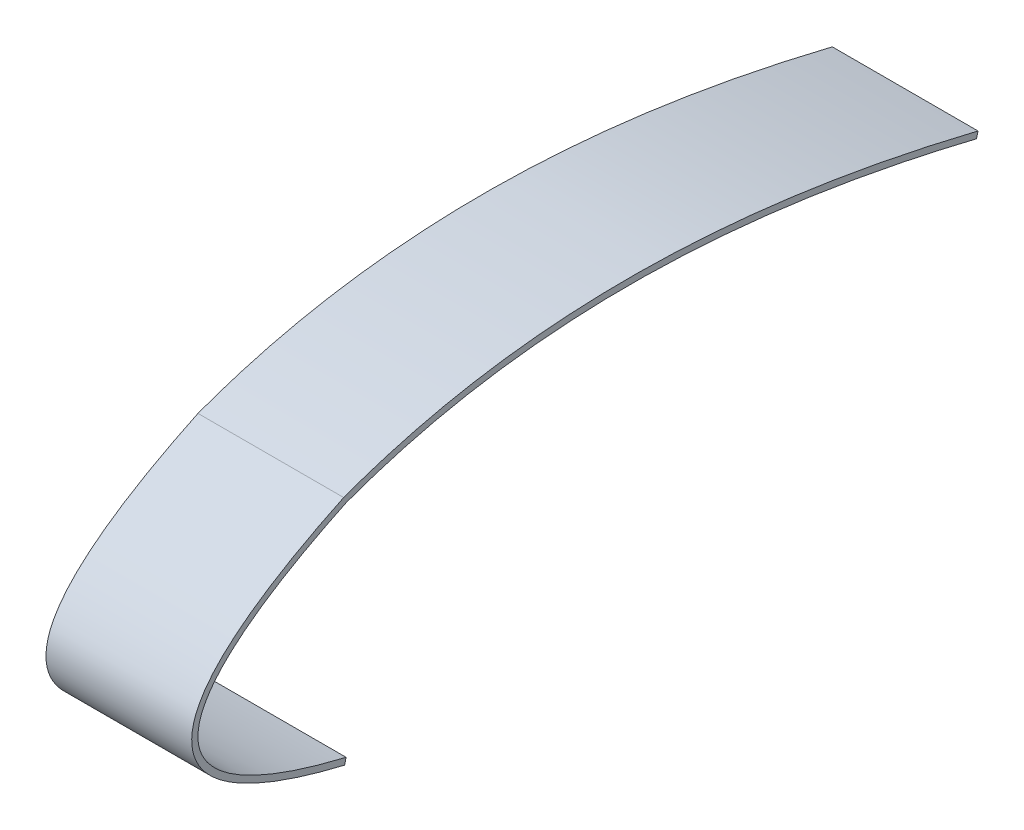
ISO-10303-21;
HEADER;
FILE_DESCRIPTION(('STEP AP214'),'2;1');
FILE_NAME('part.step','',(''),(''),'','','');
FILE_SCHEMA(('AUTOMOTIVE_DESIGN { 1 0 10303 214 1 1 1 1 }'));
ENDSEC;
DATA;
#1=APPLICATION_CONTEXT('core data for automotive mechanical design processes');
#2=APPLICATION_PROTOCOL_DEFINITION('international standard','automotive_design',2000,#1);
#3=PRODUCT_CONTEXT('',#1,'mechanical');
#4=PRODUCT('Part','Part','',(#3));
#5=PRODUCT_RELATED_PRODUCT_CATEGORY('part','',(#4));
#6=PRODUCT_DEFINITION_FORMATION('','',#4);
#7=PRODUCT_DEFINITION_CONTEXT('part definition',#1,'design');
#8=PRODUCT_DEFINITION('design','',#6,#7);
#9=PRODUCT_DEFINITION_SHAPE('','',#8);
#10=(LENGTH_UNIT() NAMED_UNIT(*) SI_UNIT(.MILLI.,.METRE.));
#11=(NAMED_UNIT(*) PLANE_ANGLE_UNIT() SI_UNIT($,.RADIAN.));
#12=(NAMED_UNIT(*) SI_UNIT($,.STERADIAN.) SOLID_ANGLE_UNIT());
#13=UNCERTAINTY_MEASURE_WITH_UNIT(LENGTH_MEASURE(1.E-05),#10,'distance_accuracy_value','');
#14=(GEOMETRIC_REPRESENTATION_CONTEXT(3) GLOBAL_UNCERTAINTY_ASSIGNED_CONTEXT((#13)) GLOBAL_UNIT_ASSIGNED_CONTEXT((#10,
#11,#12)) REPRESENTATION_CONTEXT('',''));
#15=CARTESIAN_POINT('',(0.,0.,0.));
#16=DIRECTION('',(0.,0.,1.));
#17=DIRECTION('',(1.,0.,0.));
#18=AXIS2_PLACEMENT_3D('',#15,#16,#17);
#19=CARTESIAN_POINT('',(-350.,1334.8409703343,2400.34706148792));
#20=CARTESIAN_POINT('',(-350.,1692.38382245875,1437.48815934154));
#21=CARTESIAN_POINT('',(-350.,1573.46660227095,348.254688720797));
#22=CARTESIAN_POINT('',(-350.,1334.8409703343,-628.154342243338));
#23=B_SPLINE_CURVE_WITH_KNOTS('',3,(#19,#20,#21,#22),.UNSPECIFIED.,.F.,.F.,(4,4),(0.,1.),.UNSPECIFIED.);
#24=DIRECTION('',(1.,0.,0.));
#25=VECTOR('',#24,1.);
#26=SURFACE_OF_LINEAR_EXTRUSION('',#23,#25);
#27=DIRECTION('',(1.,0.,0.));
#28=VECTOR('',#27,1.);
#29=CARTESIAN_POINT('',(-350.,1334.8409703343,-628.154342243338));
#30=LINE('',#29,#28);
#31=CARTESIAN_POINT('',(-350.,1334.8409703343,-628.154342243338));
#32=VERTEX_POINT('',#31);
#33=CARTESIAN_POINT('',(350.,1334.8409703343,-628.154342243338));
#34=VERTEX_POINT('',#33);
#35=EDGE_CURVE('E37',#32,#34,#30,.T.);
#36=ORIENTED_EDGE('',*,*,#35,.T.);
#37=CARTESIAN_POINT('',(350.,1334.8409703343,2400.34706148792));
#38=CARTESIAN_POINT('',(350.,1692.38382245875,1437.48815934154));
#39=CARTESIAN_POINT('',(350.,1573.46660227095,348.254688720797));
#40=CARTESIAN_POINT('',(350.,1334.8409703343,-628.154342243338));
#41=B_SPLINE_CURVE_WITH_KNOTS('',3,(#37,#38,#39,#40),.UNSPECIFIED.,.F.,.F.,(4,4),(0.,1.),.UNSPECIFIED.);
#42=CARTESIAN_POINT('',(350.,1334.8409703343,2400.34706148791));
#43=VERTEX_POINT('',#42);
#44=EDGE_CURVE('E86',#43,#34,#41,.T.);
#45=ORIENTED_EDGE('',*,*,#44,.F.);
#46=DIRECTION('',(1.,0.,0.));
#47=VECTOR('',#46,1.);
#48=CARTESIAN_POINT('',(-350.,1334.8409703343,2400.34706148791));
#49=LINE('',#48,#47);
#50=CARTESIAN_POINT('',(-350.,1334.8409703343,2400.34706148791));
#51=VERTEX_POINT('',#50);
#52=EDGE_CURVE('E11',#51,#43,#49,.T.);
#53=ORIENTED_EDGE('',*,*,#52,.F.);
#54=EDGE_CURVE('E87',#51,#32,#23,.T.);
#55=ORIENTED_EDGE('',*,*,#54,.T.);
#56=EDGE_LOOP('',(#36,#45,#53,#55));
#57=FACE_BOUND('',#56,.T.);
#58=ADVANCED_FACE('F33',(#57),#26,.T.);
#59=CARTESIAN_POINT('',(-350.,275.92448369592,2400.34706148791));
#60=CARTESIAN_POINT('',(-350.,608.394865861359,3787.59397149781));
#61=CARTESIAN_POINT('',(-350.,1151.34125577871,2786.94207915242));
#62=CARTESIAN_POINT('',(-350.,1334.8409703343,2400.34706148791));
#63=B_SPLINE_CURVE_WITH_KNOTS('',3,(#59,#60,#61,#62),.UNSPECIFIED.,.F.,.F.,(4,4),(0.,1.),.UNSPECIFIED.);
#64=DIRECTION('',(1.,0.,0.));
#65=VECTOR('',#64,1.);
#66=SURFACE_OF_LINEAR_EXTRUSION('',#63,#65);
#67=ORIENTED_EDGE('',*,*,#52,.T.);
#68=CARTESIAN_POINT('',(350.,275.92448369592,2400.34706148791));
#69=CARTESIAN_POINT('',(350.,608.394865861359,3787.59397149781));
#70=CARTESIAN_POINT('',(350.,1151.34125577871,2786.94207915242));
#71=CARTESIAN_POINT('',(350.,1334.8409703343,2400.34706148791));
#72=B_SPLINE_CURVE_WITH_KNOTS('',3,(#68,#69,#70,#71),.UNSPECIFIED.,.F.,.F.,(4,4),(0.,1.),.UNSPECIFIED.);
#73=CARTESIAN_POINT('',(350.,275.92448369592,2400.34706148791));
#74=VERTEX_POINT('',#73);
#75=EDGE_CURVE('E104',#74,#43,#72,.T.);
#76=ORIENTED_EDGE('',*,*,#75,.F.);
#77=DIRECTION('',(1.,0.,0.));
#78=VECTOR('',#77,1.);
#79=CARTESIAN_POINT('',(-350.,275.92448369592,2400.34706148791));
#80=LINE('',#79,#78);
#81=CARTESIAN_POINT('',(-350.,275.92448369592,2400.34706148791));
#82=VERTEX_POINT('',#81);
#83=EDGE_CURVE('E42',#82,#74,#80,.T.);
#84=ORIENTED_EDGE('',*,*,#83,.F.);
#85=EDGE_CURVE('E92',#82,#51,#63,.T.);
#86=ORIENTED_EDGE('',*,*,#85,.T.);
#87=EDGE_LOOP('',(#67,#76,#84,#86));
#88=FACE_BOUND('',#87,.T.);
#89=ADVANCED_FACE('F171',(#88),#66,.T.);
#90=CARTESIAN_POINT('',(-350.,275.92448369592,2400.34706148791));
#91=DIRECTION('',(0.,-0.233062158752236,-0.972461839949387));
#92=DIRECTION('',(0.,0.972461839949387,-0.233062158752236));
#93=AXIS2_PLACEMENT_3D('',#90,#91,#92);
#94=PLANE('',#93);
#95=ORIENTED_EDGE('',*,*,#83,.T.);
#96=DIRECTION('',(0.,0.972461839949387,-0.233062158752236));
#97=VECTOR('',#96,1.);
#98=CARTESIAN_POINT('',(350.,275.92448369592,2400.34706148791));
#99=LINE('',#98,#97);
#100=CARTESIAN_POINT('',(350.,246.750628497438,2407.33892625048));
#101=VERTEX_POINT('',#100);
#102=EDGE_CURVE('E123',#101,#74,#99,.T.);
#103=ORIENTED_EDGE('',*,*,#102,.F.);
#104=DIRECTION('',(1.,0.,0.));
#105=VECTOR('',#104,1.);
#106=CARTESIAN_POINT('',(-350.,246.750628497438,2407.33892625048));
#107=LINE('',#106,#105);
#108=CARTESIAN_POINT('',(-350.,246.750628497438,2407.33892625048));
#109=VERTEX_POINT('',#108);
#110=EDGE_CURVE('E192',#109,#101,#107,.T.);
#111=ORIENTED_EDGE('',*,*,#110,.F.);
#112=DIRECTION('',(0.,0.972461839949387,-0.233062158752236));
#113=VECTOR('',#112,1.);
#114=CARTESIAN_POINT('',(-350.,275.92448369592,2400.34706148791));
#115=LINE('',#114,#113);
#116=EDGE_CURVE('E186',#109,#82,#115,.T.);
#117=ORIENTED_EDGE('',*,*,#116,.T.);
#118=EDGE_LOOP('',(#95,#103,#111,#117));
#119=FACE_BOUND('',#118,.T.);
#120=ADVANCED_FACE('F175',(#119),#94,.T.);
#121=CARTESIAN_POINT('',(-350.,1362.50680703939,2412.02314203851));
#122=CARTESIAN_POINT('',(-350.,1361.78317329758,2413.54768500511));
#123=CARTESIAN_POINT('',(-350.,1360.34312015743,2416.58052508048));
#124=CARTESIAN_POINT('',(-350.,1357.39400042901,2422.77080695804));
#125=CARTESIAN_POINT('',(-350.,1353.63362256081,2430.62947644193));
#126=CARTESIAN_POINT('',(-350.,1348.98721506358,2440.27905885447));
#127=CARTESIAN_POINT('',(-350.,1342.62168581376,2453.41361009825));
#128=CARTESIAN_POINT('',(-350.,1334.34666201209,2470.31917875592));
#129=CARTESIAN_POINT('',(-350.,1323.92141916554,2491.31494364513));
#130=CARTESIAN_POINT('',(-350.,1313.01350814314,2512.95147287641));
#131=CARTESIAN_POINT('',(-350.,1297.84306854576,2542.56281804881));
#132=CARTESIAN_POINT('',(-350.,1277.7367357794,2580.83560050859));
#133=CARTESIAN_POINT('',(-350.,1251.87962204392,2628.22946561999));
#134=CARTESIAN_POINT('',(-350.,1224.39089200522,2676.54427813714));
#135=CARTESIAN_POINT('',(-350.,1195.36638016327,2725.23597929884));
#136=CARTESIAN_POINT('',(-350.,1154.74262304588,2789.93794521164));
#137=CARTESIAN_POINT('',(-350.,1100.5802791357,2869.04999366854));
#138=CARTESIAN_POINT('',(-350.,1030.81748143138,2956.86281482054));
#139=CARTESIAN_POINT('',(-350.,956.760832624086,3033.277910981));
#140=CARTESIAN_POINT('',(-350.,891.587905629362,3083.87048598514));
#141=CARTESIAN_POINT('',(-350.,837.188737736097,3114.08460944567));
#142=CARTESIAN_POINT('',(-350.,795.192839563806,3130.87584747398));
#143=CARTESIAN_POINT('',(-350.,752.025644532053,3140.94368078499));
#144=CARTESIAN_POINT('',(-350.,707.941066274764,3143.33002792401));
#145=CARTESIAN_POINT('',(-350.,663.534332821124,3137.16462458449));
#146=CARTESIAN_POINT('',(-350.,619.601279239483,3121.91959623117));
#147=CARTESIAN_POINT('',(-350.,576.773990458459,3097.43162615676));
#148=CARTESIAN_POINT('',(-350.,535.312995392649,3063.63600201536));
#149=CARTESIAN_POINT('',(-350.,495.202891061897,3020.33285057272));
#150=CARTESIAN_POINT('',(-350.,456.332447081167,2967.14397232415));
#151=CARTESIAN_POINT('',(-350.,418.602076563617,2903.56841270118));
#152=CARTESIAN_POINT('',(-350.,388.065023687092,2841.46379461865));
#153=CARTESIAN_POINT('',(-350.,364.174359873558,2786.01134853059));
#154=CARTESIAN_POINT('',(-350.,346.528645613746,2741.46349569755));
#155=CARTESIAN_POINT('',(-350.,329.1592206076,2693.88309686318));
#156=CARTESIAN_POINT('',(-350.,312.071812213272,2643.19625658807));
#157=CARTESIAN_POINT('',(-350.,298.073115591743,2598.30718401634));
#158=CARTESIAN_POINT('',(-350.,287.022666072926,2560.76926204262));
#159=CARTESIAN_POINT('',(-350.,278.810184481203,2531.79338596945));
#160=CARTESIAN_POINT('',(-350.,270.674171138083,2501.98589314048));
#161=CARTESIAN_POINT('',(-350.,263.958923859324,2476.44597438115));
#162=CARTESIAN_POINT('',(-350.,258.626064752224,2455.58876542587));
#163=CARTESIAN_POINT('',(-350.,254.646575466953,2439.73346596301));
#164=CARTESIAN_POINT('',(-350.,251.346143992609,2426.33811750049));
#165=CARTESIAN_POINT('',(-350.,248.717882491367,2415.52222142722));
#166=CARTESIAN_POINT('',(-350.,247.403512299744,2410.06311188002));
#167=CARTESIAN_POINT('',(-350.,246.750628497438,2407.33892625048));
#168=B_SPLINE_CURVE_WITH_KNOTS('',3,(#121,#122,#123,#124,#125,#126,#127,#128,#129,#130,#131,
#132,#133,#134,#135,#136,#137,#138,#139,#140,#141,#142,#143,#144,#145,#146,#147,#148,#149,#150,
#151,#152,#153,#154,#155,#156,#157,#158,#159,#160,#161,#162,#163,#164,#165,#166,#167),
.UNSPECIFIED.,.F.,.F.,(4,1,1,1,1,1,1,1,1,1,1,1,1,1,1,1,1,1,1,1,1,1,1,1,1,1,1,1,1,1,1,1,1,1,1,1,
1,1,1,1,1,1,1,1,4),(-0.00102434549164735,0.00288590585792939,0.00679615720750614,
0.0146166599066596,0.0224371626058131,0.0302576653049666,0.0458986707032736,0.0615396761015806,
0.0771806814998876,0.0928216868981946,0.124103697694809,0.155385708491423,0.186667719288037,
0.217949730084651,0.249231740881264,0.311795762474492,0.37435978406772,0.436923805660948,
0.499487827254176,0.53076983805079,0.562051848847404,0.593333859644018,0.624615870440632,
0.655897881237246,0.68717989203386,0.718461902830474,0.749743913627088,0.781025924423702,
0.812307935220316,0.84358994601693,0.874871956813544,0.890512962211851,0.906153967610158,
0.921794973008465,0.937435978406772,0.953076983805079,0.960897486504233,0.968717989203386,
0.976538491902539,0.984358994601693,0.98826924595127,0.992179497300847,0.996089748650423,
0.998044874325212,1.),.UNSPECIFIED.);
#169=DIRECTION('',(1.,0.,0.));
#170=VECTOR('',#169,1.);
#171=SURFACE_OF_LINEAR_EXTRUSION('',#168,#170);
#172=ORIENTED_EDGE('',*,*,#110,.T.);
#173=CARTESIAN_POINT('',(350.,1362.50680703939,2412.02314203851));
#174=CARTESIAN_POINT('',(350.,1361.78317329758,2413.54768500511));
#175=CARTESIAN_POINT('',(350.,1360.34312015743,2416.58052508048));
#176=CARTESIAN_POINT('',(350.,1357.39400042901,2422.77080695804));
#177=CARTESIAN_POINT('',(350.,1353.63362256081,2430.62947644193));
#178=CARTESIAN_POINT('',(350.,1348.98721506358,2440.27905885447));
#179=CARTESIAN_POINT('',(350.,1342.62168581376,2453.41361009825));
#180=CARTESIAN_POINT('',(350.,1334.34666201209,2470.31917875592));
#181=CARTESIAN_POINT('',(350.,1323.92141916554,2491.31494364513));
#182=CARTESIAN_POINT('',(350.,1313.01350814314,2512.95147287641));
#183=CARTESIAN_POINT('',(350.,1297.84306854576,2542.56281804881));
#184=CARTESIAN_POINT('',(350.,1277.7367357794,2580.83560050859));
#185=CARTESIAN_POINT('',(350.,1251.87962204392,2628.22946561999));
#186=CARTESIAN_POINT('',(350.,1224.39089200522,2676.54427813714));
#187=CARTESIAN_POINT('',(350.,1195.36638016327,2725.23597929884));
#188=CARTESIAN_POINT('',(350.,1154.74262304588,2789.93794521164));
#189=CARTESIAN_POINT('',(350.,1100.5802791357,2869.04999366854));
#190=CARTESIAN_POINT('',(350.,1030.81748143138,2956.86281482054));
#191=CARTESIAN_POINT('',(350.,956.760832624086,3033.277910981));
#192=CARTESIAN_POINT('',(350.,891.587905629362,3083.87048598514));
#193=CARTESIAN_POINT('',(350.,837.188737736097,3114.08460944567));
#194=CARTESIAN_POINT('',(350.,795.192839563806,3130.87584747398));
#195=CARTESIAN_POINT('',(350.,752.025644532053,3140.94368078499));
#196=CARTESIAN_POINT('',(350.,707.941066274764,3143.33002792401));
#197=CARTESIAN_POINT('',(350.,663.534332821124,3137.16462458449));
#198=CARTESIAN_POINT('',(350.,619.601279239483,3121.91959623117));
#199=CARTESIAN_POINT('',(350.,576.773990458459,3097.43162615676));
#200=CARTESIAN_POINT('',(350.,535.312995392649,3063.63600201536));
#201=CARTESIAN_POINT('',(350.,495.202891061897,3020.33285057272));
#202=CARTESIAN_POINT('',(350.,456.332447081167,2967.14397232415));
#203=CARTESIAN_POINT('',(350.,418.602076563617,2903.56841270118));
#204=CARTESIAN_POINT('',(350.,388.065023687092,2841.46379461865));
#205=CARTESIAN_POINT('',(350.,364.174359873558,2786.01134853059));
#206=CARTESIAN_POINT('',(350.,346.528645613746,2741.46349569755));
#207=CARTESIAN_POINT('',(350.,329.1592206076,2693.88309686318));
#208=CARTESIAN_POINT('',(350.,312.071812213272,2643.19625658807));
#209=CARTESIAN_POINT('',(350.,298.073115591743,2598.30718401634));
#210=CARTESIAN_POINT('',(350.,287.022666072926,2560.76926204262));
#211=CARTESIAN_POINT('',(350.,278.810184481203,2531.79338596945));
#212=CARTESIAN_POINT('',(350.,270.674171138083,2501.98589314048));
#213=CARTESIAN_POINT('',(350.,263.958923859324,2476.44597438115));
#214=CARTESIAN_POINT('',(350.,258.626064752224,2455.58876542587));
#215=CARTESIAN_POINT('',(350.,254.646575466953,2439.73346596301));
#216=CARTESIAN_POINT('',(350.,251.346143992609,2426.33811750049));
#217=CARTESIAN_POINT('',(350.,248.717882491367,2415.52222142722));
#218=CARTESIAN_POINT('',(350.,247.403512299744,2410.06311188002));
#219=CARTESIAN_POINT('',(350.,246.750628497438,2407.33892625048));
#220=B_SPLINE_CURVE_WITH_KNOTS('',3,(#173,#174,#175,#176,#177,#178,#179,#180,#181,#182,#183,
#184,#185,#186,#187,#188,#189,#190,#191,#192,#193,#194,#195,#196,#197,#198,#199,#200,#201,#202,
#203,#204,#205,#206,#207,#208,#209,#210,#211,#212,#213,#214,#215,#216,#217,#218,#219),
.UNSPECIFIED.,.F.,.F.,(4,1,1,1,1,1,1,1,1,1,1,1,1,1,1,1,1,1,1,1,1,1,1,1,1,1,1,1,1,1,1,1,1,1,1,1,
1,1,1,1,1,1,1,1,4),(-0.00102434549164735,0.00288590585792939,0.00679615720750614,
0.0146166599066596,0.0224371626058131,0.0302576653049666,0.0458986707032736,0.0615396761015806,
0.0771806814998876,0.0928216868981946,0.124103697694809,0.155385708491423,0.186667719288037,
0.217949730084651,0.249231740881264,0.311795762474492,0.37435978406772,0.436923805660948,
0.499487827254176,0.53076983805079,0.562051848847404,0.593333859644018,0.624615870440632,
0.655897881237246,0.68717989203386,0.718461902830474,0.749743913627088,0.781025924423702,
0.812307935220316,0.84358994601693,0.874871956813544,0.890512962211851,0.906153967610158,
0.921794973008465,0.937435978406772,0.953076983805079,0.960897486504233,0.968717989203386,
0.976538491902539,0.984358994601693,0.98826924595127,0.992179497300847,0.996089748650423,
0.998044874325212,1.),.UNSPECIFIED.);
#221=CARTESIAN_POINT('',(350.,1362.50680703939,2412.02314203851));
#222=VERTEX_POINT('',#221);
#223=EDGE_CURVE('E115',#222,#101,#220,.T.);
#224=ORIENTED_EDGE('',*,*,#223,.F.);
#225=DIRECTION('',(1.,0.,0.));
#226=VECTOR('',#225,1.);
#227=CARTESIAN_POINT('',(-350.,1362.50680703939,2412.02314203851));
#228=LINE('',#227,#226);
#229=CARTESIAN_POINT('',(-350.,1362.50680703939,2412.02314203851));
#230=VERTEX_POINT('',#229);
#231=EDGE_CURVE('E194',#230,#222,#228,.T.);
#232=ORIENTED_EDGE('',*,*,#231,.F.);
#233=EDGE_CURVE('E148',#230,#109,#168,.T.);
#234=ORIENTED_EDGE('',*,*,#233,.T.);
#235=EDGE_LOOP('',(#172,#224,#232,#234));
#236=FACE_BOUND('',#235,.T.);
#237=ADVANCED_FACE('F160',(#236),#171,.T.);
#238=CARTESIAN_POINT('',(-350.,1363.9832993857,-635.276466747993));
#239=CARTESIAN_POINT('',(-350.,1367.72874432944,-619.950844607721));
#240=CARTESIAN_POINT('',(-350.,1375.14472002762,-589.310787735137));
#241=CARTESIAN_POINT('',(-350.,1386.09849322537,-543.132871997895));
#242=CARTESIAN_POINT('',(-350.,1396.85704689941,-496.81135693345));
#243=CARTESIAN_POINT('',(-350.,1410.93650383166,-434.840693875423));
#244=CARTESIAN_POINT('',(-350.,1428.01512227226,-357.011004213728));
#245=CARTESIAN_POINT('',(-350.,1447.61141598954,-263.069150026773));
#246=CARTESIAN_POINT('',(-350.,1466.24361198764,-168.62546933241));
#247=CARTESIAN_POINT('',(-350.,1489.71335100049,-42.0890306229441));
#248=CARTESIAN_POINT('',(-350.,1516.3110472344,117.119449152878));
#249=CARTESIAN_POINT('',(-350.,1543.3175085608,309.483277706009));
#250=CARTESIAN_POINT('',(-350.,1572.07370611324,567.257307297787));
#251=CARTESIAN_POINT('',(-350.,1593.09772341436,891.024329092097));
#252=CARTESIAN_POINT('',(-350.,1590.68686125343,1214.54152342821));
#253=CARTESIAN_POINT('',(-350.,1572.56299832232,1471.80771330099));
#254=CARTESIAN_POINT('',(-350.,1550.33712480084,1663.63119008532));
#255=CARTESIAN_POINT('',(-350.,1518.94242518547,1853.97404275949));
#256=CARTESIAN_POINT('',(-350.,1484.69266935294,2011.06109631114));
#257=CARTESIAN_POINT('',(-350.,1452.1724783097,2135.63103142592));
#258=CARTESIAN_POINT('',(-350.,1425.15544672189,2228.46260162876));
#259=CARTESIAN_POINT('',(-350.,1400.3961266064,2305.28907059822));
#260=CARTESIAN_POINT('',(-350.,1381.85767639757,2358.76453934701));
#261=CARTESIAN_POINT('',(-350.,1372.28196064172,2385.42781594036));
#262=CARTESIAN_POINT('',(-350.,1367.41860788909,2398.73514727144));
#263=CARTESIAN_POINT('',(-350.,1364.6153647789,2406.34101501342));
#264=CARTESIAN_POINT('',(-350.,1363.2104691491,2410.12818784658));
#265=CARTESIAN_POINT('',(-350.,1362.50680703939,2412.02314203851));
#266=B_SPLINE_CURVE_WITH_KNOTS('',3,(#238,#239,#240,#241,#242,#243,#244,#245,#246,#247,#248,
#249,#250,#251,#252,#253,#254,#255,#256,#257,#258,#259,#260,#261,#262,#263,#264,#265),
.UNSPECIFIED.,.F.,.F.,(4,1,1,1,1,1,1,1,1,1,1,1,1,1,1,1,1,1,1,1,1,1,1,1,1,4),(0.,
0.0156316685438474,0.0312633370876947,0.0468950056315421,0.0625266741753894,0.0937900112630841,
0.125053348350779,0.156316685438474,0.187580022526168,0.250106696701558,0.312633370876947,
0.375160045052337,0.500213393403115,0.625266741753894,0.687793415929284,0.750320090104673,
0.812846764280063,0.875373438455452,0.906636775543147,0.937900112630841,0.969163449718536,
0.984795118262384,0.992610952534307,0.996518869670269,0.99847282823825,1.00042678680623),.UNSPECIFIED.);
#267=DIRECTION('',(1.,0.,0.));
#268=VECTOR('',#267,1.);
#269=SURFACE_OF_LINEAR_EXTRUSION('',#266,#268);
#270=ORIENTED_EDGE('',*,*,#231,.T.);
#271=CARTESIAN_POINT('',(350.,1363.9832993857,-635.276466747993));
#272=CARTESIAN_POINT('',(350.,1367.72874432944,-619.950844607721));
#273=CARTESIAN_POINT('',(350.,1375.14472002762,-589.310787735137));
#274=CARTESIAN_POINT('',(350.,1386.09849322537,-543.132871997895));
#275=CARTESIAN_POINT('',(350.,1396.85704689941,-496.81135693345));
#276=CARTESIAN_POINT('',(350.,1410.93650383166,-434.840693875423));
#277=CARTESIAN_POINT('',(350.,1428.01512227226,-357.011004213728));
#278=CARTESIAN_POINT('',(350.,1447.61141598954,-263.069150026773));
#279=CARTESIAN_POINT('',(350.,1466.24361198764,-168.62546933241));
#280=CARTESIAN_POINT('',(350.,1489.71335100049,-42.0890306229441));
#281=CARTESIAN_POINT('',(350.,1516.3110472344,117.119449152878));
#282=CARTESIAN_POINT('',(350.,1543.3175085608,309.483277706009));
#283=CARTESIAN_POINT('',(350.,1572.07370611324,567.257307297787));
#284=CARTESIAN_POINT('',(350.,1593.09772341436,891.024329092097));
#285=CARTESIAN_POINT('',(350.,1590.68686125343,1214.54152342821));
#286=CARTESIAN_POINT('',(350.,1572.56299832232,1471.80771330099));
#287=CARTESIAN_POINT('',(350.,1550.33712480084,1663.63119008532));
#288=CARTESIAN_POINT('',(350.,1518.94242518547,1853.97404275949));
#289=CARTESIAN_POINT('',(350.,1484.69266935294,2011.06109631114));
#290=CARTESIAN_POINT('',(350.,1452.1724783097,2135.63103142592));
#291=CARTESIAN_POINT('',(350.,1425.15544672189,2228.46260162876));
#292=CARTESIAN_POINT('',(350.,1400.3961266064,2305.28907059822));
#293=CARTESIAN_POINT('',(350.,1381.85767639757,2358.76453934701));
#294=CARTESIAN_POINT('',(350.,1372.28196064172,2385.42781594036));
#295=CARTESIAN_POINT('',(350.,1367.41860788909,2398.73514727144));
#296=CARTESIAN_POINT('',(350.,1364.6153647789,2406.34101501342));
#297=CARTESIAN_POINT('',(350.,1363.2104691491,2410.12818784658));
#298=CARTESIAN_POINT('',(350.,1362.50680703939,2412.02314203851));
#299=B_SPLINE_CURVE_WITH_KNOTS('',3,(#271,#272,#273,#274,#275,#276,#277,#278,#279,#280,#281,
#282,#283,#284,#285,#286,#287,#288,#289,#290,#291,#292,#293,#294,#295,#296,#297,#298),
.UNSPECIFIED.,.F.,.F.,(4,1,1,1,1,1,1,1,1,1,1,1,1,1,1,1,1,1,1,1,1,1,1,1,1,4),(0.,
0.0156316685438474,0.0312633370876947,0.0468950056315421,0.0625266741753894,0.0937900112630841,
0.125053348350779,0.156316685438474,0.187580022526168,0.250106696701558,0.312633370876947,
0.375160045052337,0.500213393403115,0.625266741753894,0.687793415929284,0.750320090104673,
0.812846764280063,0.875373438455452,0.906636775543147,0.937900112630841,0.969163449718536,
0.984795118262384,0.992610952534307,0.996518869670269,0.99847282823825,1.00042678680623),.UNSPECIFIED.);
#300=CARTESIAN_POINT('',(350.,1363.9832993857,-635.276466747993));
#301=VERTEX_POINT('',#300);
#302=EDGE_CURVE('E99',#301,#222,#299,.T.);
#303=ORIENTED_EDGE('',*,*,#302,.F.);
#304=DIRECTION('',(1.,0.,0.));
#305=VECTOR('',#304,1.);
#306=CARTESIAN_POINT('',(-350.,1363.9832993857,-635.276466747993));
#307=LINE('',#306,#305);
#308=CARTESIAN_POINT('',(-350.,1363.9832993857,-635.276466747993));
#309=VERTEX_POINT('',#308);
#310=EDGE_CURVE('E91',#309,#301,#307,.T.);
#311=ORIENTED_EDGE('',*,*,#310,.F.);
#312=EDGE_CURVE('E142',#309,#230,#266,.T.);
#313=ORIENTED_EDGE('',*,*,#312,.T.);
#314=EDGE_LOOP('',(#270,#303,#311,#313));
#315=FACE_BOUND('',#314,.T.);
#316=ADVANCED_FACE('F157',(#315),#269,.T.);
#317=CARTESIAN_POINT('',(-350.,1334.8409703343,-628.154342243338));
#318=DIRECTION('',(0.,-0.237404150155189,-0.971410968380063));
#319=DIRECTION('',(0.,0.971410968380063,-0.237404150155189));
#320=AXIS2_PLACEMENT_3D('',#317,#318,#319);
#321=PLANE('',#320);
#322=ORIENTED_EDGE('',*,*,#310,.T.);
#323=DIRECTION('',(0.,0.971410968380064,-0.237404150155189));
#324=VECTOR('',#323,1.);
#325=CARTESIAN_POINT('',(350.,1334.8409703343,-628.154342243338));
#326=LINE('',#325,#324);
#327=EDGE_CURVE('E94',#34,#301,#326,.T.);
#328=ORIENTED_EDGE('',*,*,#327,.F.);
#329=ORIENTED_EDGE('',*,*,#35,.F.);
#330=DIRECTION('',(0.,0.971410968380064,-0.237404150155189));
#331=VECTOR('',#330,1.);
#332=CARTESIAN_POINT('',(-350.,1334.8409703343,-628.154342243338));
#333=LINE('',#332,#331);
#334=EDGE_CURVE('E137',#32,#309,#333,.T.);
#335=ORIENTED_EDGE('',*,*,#334,.T.);
#336=EDGE_LOOP('',(#322,#328,#329,#335));
#337=FACE_BOUND('',#336,.T.);
#338=ADVANCED_FACE('F95',(#337),#321,.T.);
#339=CARTESIAN_POINT('',(-350.,1558.40415185721,891.177657928948));
#340=DIRECTION('',(-1.,0.,0.));
#341=DIRECTION('',(0.,0.,1.));
#342=AXIS2_PLACEMENT_3D('',#339,#340,#341);
#343=PLANE('',#342);
#344=ORIENTED_EDGE('',*,*,#54,.F.);
#345=ORIENTED_EDGE('',*,*,#85,.F.);
#346=ORIENTED_EDGE('',*,*,#116,.F.);
#347=ORIENTED_EDGE('',*,*,#233,.F.);
#348=ORIENTED_EDGE('',*,*,#312,.F.);
#349=ORIENTED_EDGE('',*,*,#334,.F.);
#350=EDGE_LOOP('',(#344,#345,#346,#347,#348,#349));
#351=FACE_BOUND('',#350,.T.);
#352=ADVANCED_FACE('F164',(#351),#343,.T.);
#353=CARTESIAN_POINT('',(350.,1558.40415185721,891.177657928948));
#354=DIRECTION('',(-1.,0.,0.));
#355=DIRECTION('',(0.,0.,1.));
#356=AXIS2_PLACEMENT_3D('',#353,#354,#355);
#357=PLANE('',#356);
#358=ORIENTED_EDGE('',*,*,#44,.T.);
#359=ORIENTED_EDGE('',*,*,#327,.T.);
#360=ORIENTED_EDGE('',*,*,#302,.T.);
#361=ORIENTED_EDGE('',*,*,#223,.T.);
#362=ORIENTED_EDGE('',*,*,#102,.T.);
#363=ORIENTED_EDGE('',*,*,#75,.T.);
#364=EDGE_LOOP('',(#358,#359,#360,#361,#362,#363));
#365=FACE_BOUND('',#364,.T.);
#366=ADVANCED_FACE('F102',(#365),#357,.F.);
#367=CLOSED_SHELL('',(#58,#89,#120,#237,#316,#338,#352,#366));
#368=MANIFOLD_SOLID_BREP('B2',#367);
#369=ADVANCED_BREP_SHAPE_REPRESENTATION('',(#18,#368),#14);
#370=SHAPE_DEFINITION_REPRESENTATION(#9,#369);
ENDSEC;
END-ISO-10303-21;
